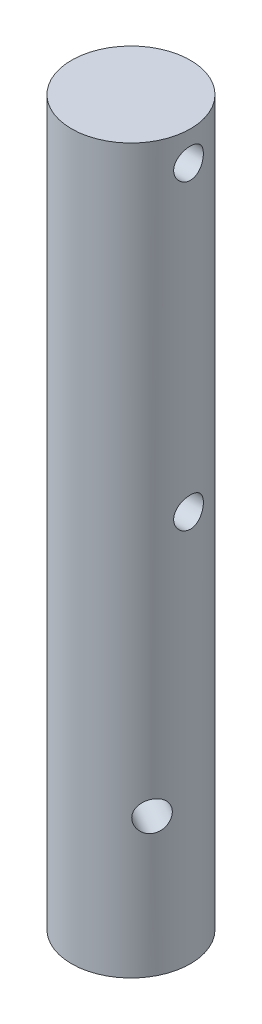
ISO-10303-21;
HEADER;
FILE_DESCRIPTION(('STEP AP214'),'2;1');
FILE_NAME('part.step','',(''),(''),'','','');
FILE_SCHEMA(('AUTOMOTIVE_DESIGN { 1 0 10303 214 1 1 1 1 }'));
ENDSEC;
DATA;
#1=APPLICATION_CONTEXT('core data for automotive mechanical design processes');
#2=APPLICATION_PROTOCOL_DEFINITION('international standard','automotive_design',2000,#1);
#3=PRODUCT_CONTEXT('',#1,'mechanical');
#4=PRODUCT('Part','Part','',(#3));
#5=PRODUCT_RELATED_PRODUCT_CATEGORY('part','',(#4));
#6=PRODUCT_DEFINITION_FORMATION('','',#4);
#7=PRODUCT_DEFINITION_CONTEXT('part definition',#1,'design');
#8=PRODUCT_DEFINITION('design','',#6,#7);
#9=PRODUCT_DEFINITION_SHAPE('','',#8);
#10=(LENGTH_UNIT() NAMED_UNIT(*) SI_UNIT(.MILLI.,.METRE.));
#11=(NAMED_UNIT(*) PLANE_ANGLE_UNIT() SI_UNIT($,.RADIAN.));
#12=(NAMED_UNIT(*) SI_UNIT($,.STERADIAN.) SOLID_ANGLE_UNIT());
#13=UNCERTAINTY_MEASURE_WITH_UNIT(LENGTH_MEASURE(1.E-05),#10,'distance_accuracy_value','');
#14=(GEOMETRIC_REPRESENTATION_CONTEXT(3) GLOBAL_UNCERTAINTY_ASSIGNED_CONTEXT((#13)) GLOBAL_UNIT_ASSIGNED_CONTEXT((#10,
#11,#12)) REPRESENTATION_CONTEXT('',''));
#15=CARTESIAN_POINT('',(0.,0.,0.));
#16=DIRECTION('',(0.,0.,1.));
#17=DIRECTION('',(1.,0.,0.));
#18=AXIS2_PLACEMENT_3D('',#15,#16,#17);
#19=CARTESIAN_POINT('',(-19.0091828831705,-210.,-53.2448828787845));
#20=DIRECTION('',(0.,-1.,0.));
#21=DIRECTION('',(0.,0.,-1.));
#22=AXIS2_PLACEMENT_3D('',#19,#20,#21);
#23=CYLINDRICAL_SURFACE('',#22,6.);
#24=CARTESIAN_POINT('',(-19.0091828831705,-210.,-53.2448828787845));
#25=DIRECTION('',(0.,1.,0.));
#26=DIRECTION('',(0.,0.,1.));
#27=AXIS2_PLACEMENT_3D('',#24,#25,#26);
#28=CIRCLE('',#27,6.);
#29=CARTESIAN_POINT('',(-19.0091828831705,-210.,-47.2448828787845));
#30=VERTEX_POINT('',#29);
#31=EDGE_CURVE('E10',#30,#30,#28,.T.);
#32=ORIENTED_EDGE('',*,*,#31,.F.);
#33=EDGE_LOOP('',(#32));
#34=FACE_BOUND('',#33,.T.);
#35=CARTESIAN_POINT('',(-19.0091828831705,-283.,-53.2448828787845));
#36=DIRECTION('',(0.,1.,0.));
#37=DIRECTION('',(0.,0.,1.));
#38=AXIS2_PLACEMENT_3D('',#35,#36,#37);
#39=CIRCLE('',#38,6.);
#40=CARTESIAN_POINT('',(-19.0091828831705,-283.,-47.2448828787845));
#41=VERTEX_POINT('',#40);
#42=EDGE_CURVE('E51',#41,#41,#39,.T.);
#43=ORIENTED_EDGE('',*,*,#42,.T.);
#44=EDGE_LOOP('',(#43));
#45=FACE_BOUND('',#44,.T.);
#46=CARTESIAN_POINT('',(-24.8186579024817,-213.,-51.7448828787845));
#47=CARTESIAN_POINT('',(-24.8186594836824,-212.917169549445,-51.7448852316294));
#48=CARTESIAN_POINT('',(-24.820448719254,-212.834313060793,-51.7517671314861));
#49=CARTESIAN_POINT('',(-24.82739405513,-212.670979453096,-51.779069003506));
#50=CARTESIAN_POINT('',(-24.8325521149014,-212.590503747319,-51.7994968547392));
#51=CARTESIAN_POINT('',(-24.8456152307463,-212.434317877088,-51.8531881590053));
#52=CARTESIAN_POINT('',(-24.853516739313,-212.358601706769,-51.8864350420718));
#53=CARTESIAN_POINT('',(-24.8711720353434,-212.213813488476,-51.9647701940276));
#54=CARTESIAN_POINT('',(-24.8809259014415,-212.144741722752,-52.0098589656481));
#55=CARTESIAN_POINT('',(-24.9014271813042,-212.013683012843,-52.1116578223974));
#56=CARTESIAN_POINT('',(-24.9121904689087,-211.95186383979,-52.1685807461621));
#57=CARTESIAN_POINT('',(-24.9333601362623,-211.838543163384,-52.2919736403241));
#58=CARTESIAN_POINT('',(-24.9437664825689,-211.787042624627,-52.3584445022763));
#59=CARTESIAN_POINT('',(-24.963225376294,-211.695134719421,-52.5001957581371));
#60=CARTESIAN_POINT('',(-24.9722570075741,-211.654892167103,-52.5755861330674));
#61=CARTESIAN_POINT('',(-24.9877677547264,-211.587714213508,-52.7323249682088));
#62=CARTESIAN_POINT('',(-24.9942472471766,-211.560776848851,-52.8136725473093));
#63=CARTESIAN_POINT('',(-25.0038114362596,-211.521511299253,-52.978267623532));
#64=CARTESIAN_POINT('',(-25.0069622462364,-211.508898213404,-53.0614432470551));
#65=CARTESIAN_POINT('',(-25.0097444478143,-211.497744972435,-53.2287855872268));
#66=CARTESIAN_POINT('',(-25.0093763597508,-211.499202736674,-53.3129521555073));
#67=CARTESIAN_POINT('',(-25.0052114528917,-211.51594491015,-53.4779112495431));
#68=CARTESIAN_POINT('',(-25.0014908972158,-211.530921795032,-53.5587372021861));
#69=CARTESIAN_POINT('',(-24.9911279023197,-211.573782762029,-53.716690249905));
#70=CARTESIAN_POINT('',(-24.9844853075612,-211.601667531226,-53.7938171478401));
#71=CARTESIAN_POINT('',(-24.9689079413759,-211.669801542412,-53.9429929340372));
#72=CARTESIAN_POINT('',(-24.9599530013409,-211.710160226797,-54.0149896434342));
#73=CARTESIAN_POINT('',(-24.9407223060284,-211.80201340747,-54.1512963122952));
#74=CARTESIAN_POINT('',(-24.9304463210855,-211.853509841136,-54.2156049314127));
#75=CARTESIAN_POINT('',(-24.9093651657877,-211.967825245189,-54.3365439314119));
#76=CARTESIAN_POINT('',(-24.898553200326,-212.030912935409,-54.3929193973973));
#77=CARTESIAN_POINT('',(-24.8778731442708,-212.165759984124,-54.494347442729));
#78=CARTESIAN_POINT('',(-24.8680050978064,-212.237519747695,-54.5393994928535));
#79=CARTESIAN_POINT('',(-24.8503058641604,-212.388174020489,-54.6170650723184));
#80=CARTESIAN_POINT('',(-24.8424847855249,-212.467101438188,-54.6496172292402));
#81=CARTESIAN_POINT('',(-24.8298947240103,-212.629551280846,-54.700911309739));
#82=CARTESIAN_POINT('',(-24.8251250880318,-212.71307271839,-54.7196561886138));
#83=CARTESIAN_POINT('',(-24.8193150194054,-212.879975700914,-54.7423806619836));
#84=CARTESIAN_POINT('',(-24.8181794177324,-212.963302675998,-54.7467371631363));
#85=CARTESIAN_POINT('',(-24.8195069440568,-213.129493161947,-54.7415930730938));
#86=CARTESIAN_POINT('',(-24.8219697407781,-213.212356714771,-54.7320937574938));
#87=CARTESIAN_POINT('',(-24.8301253748979,-213.373868558973,-54.6998381571471));
#88=CARTESIAN_POINT('',(-24.8357647045768,-213.452563635943,-54.6773013197535));
#89=CARTESIAN_POINT('',(-24.8495871927963,-213.605058874711,-54.6198537277868));
#90=CARTESIAN_POINT('',(-24.8577706526622,-213.678858455433,-54.584941507412));
#91=CARTESIAN_POINT('',(-24.8759597057301,-213.82106476672,-54.5029452795464));
#92=CARTESIAN_POINT('',(-24.8859978948104,-213.889337304026,-54.4556359310859));
#93=CARTESIAN_POINT('',(-24.9066853816008,-214.017113017681,-54.3504733181862));
#94=CARTESIAN_POINT('',(-24.9173347795414,-214.07661474999,-54.2926183209926));
#95=CARTESIAN_POINT('',(-24.9383673013602,-214.186686625543,-54.1662769602616));
#96=CARTESIAN_POINT('',(-24.9487370955415,-214.236996037529,-54.0975608075819));
#97=CARTESIAN_POINT('',(-24.9677661828529,-214.325361520171,-53.9524369028265));
#98=CARTESIAN_POINT('',(-24.9764255651943,-214.363418229965,-53.8760295522209));
#99=CARTESIAN_POINT('',(-24.9910035776004,-214.425867620717,-53.7182201813811));
#100=CARTESIAN_POINT('',(-24.996941863305,-214.450358570627,-53.6368589503263));
#101=CARTESIAN_POINT('',(-25.0054946435453,-214.485276200765,-53.4710075192627));
#102=CARTESIAN_POINT('',(-25.008109779531,-214.495705595243,-53.3865179263463));
#103=CARTESIAN_POINT('',(-25.0096954243027,-214.502051384363,-53.2192575891195));
#104=CARTESIAN_POINT('',(-25.0087625663707,-214.498352563643,-53.1365021383354));
#105=CARTESIAN_POINT('',(-25.0035713300319,-214.477428259058,-52.9728316341624));
#106=CARTESIAN_POINT('',(-24.999313050527,-214.46020317748,-52.8919165261131));
#107=CARTESIAN_POINT('',(-24.98796437598,-214.412921670344,-52.7346263253173));
#108=CARTESIAN_POINT('',(-24.9808893507105,-214.382934820028,-52.6582291369129));
#109=CARTESIAN_POINT('',(-24.9646522168713,-214.311044131471,-52.5115072992223));
#110=CARTESIAN_POINT('',(-24.9554898452366,-214.269138790996,-52.4411834168869));
#111=CARTESIAN_POINT('',(-24.9357916283905,-214.173427149004,-52.3067799861486));
#112=CARTESIAN_POINT('',(-24.9252281373547,-214.119359785639,-52.2428903963336));
#113=CARTESIAN_POINT('',(-24.9040426189692,-214.001365722039,-52.1249603483776));
#114=CARTESIAN_POINT('',(-24.8934205774589,-213.937436525853,-52.0709223911822));
#115=CARTESIAN_POINT('',(-24.8730950210788,-213.800097878698,-51.9732398390656));
#116=CARTESIAN_POINT('',(-24.8634123391188,-213.726533814881,-51.9298079496147));
#117=CARTESIAN_POINT('',(-24.8463422164298,-213.572916765116,-51.855992533861));
#118=CARTESIAN_POINT('',(-24.8389531068711,-213.49286855084,-51.8255995141449));
#119=CARTESIAN_POINT('',(-24.8284615142673,-213.34413448226,-51.7832490859363));
#120=CARTESIAN_POINT('',(-24.8248128281787,-213.276160253424,-51.7688931228914));
#121=CARTESIAN_POINT('',(-24.8199104619541,-213.1387966965,-51.7497094399246));
#122=CARTESIAN_POINT('',(-24.81865657752,-213.069407489632,-51.7448809072262));
#123=CARTESIAN_POINT('',(-24.8186579024817,-213.,-51.7448828787845));
#124=B_SPLINE_CURVE_WITH_KNOTS('',3,(#46,#47,#48,#49,#50,#51,#52,#53,#54,#55,#56,#57,#58,#59,
#60,#61,#62,#63,#64,#65,#66,#67,#68,#69,#70,#71,#72,#73,#74,#75,#76,#77,#78,#79,#80,#81,#82,#83,
#84,#85,#86,#87,#88,#89,#90,#91,#92,#93,#94,#95,#96,#97,#98,#99,#100,#101,#102,#103,#104,#105,
#106,#107,#108,#109,#110,#111,#112,#113,#114,#115,#116,#117,#118,#119,#120,#121,#122,#123),
.UNSPECIFIED.,.T.,.F.,(4,2,2,2,2,2,2,2,2,2,2,2,2,2,2,2,2,2,2,2,2,2,2,2,2,2,2,2,2,2,2,2,2,2,2,2,
2,2,4),(0.,0.248236465041684,0.496617444857199,0.744678436299644,0.992749960532891,
1.24574372515788,1.49876112887921,1.75530897838753,2.01181895908258,2.26313250597209,
2.51440889199613,2.7601095761337,3.00582334034872,3.25375724552665,3.50173431281347,
3.75642279943147,4.01112318719882,4.26705859205042,4.52293920077729,4.77206144857032,
5.02116076310284,5.26618443005529,5.51123712852856,5.76109707515499,6.01099811331029,
6.26715198579193,6.52329249431732,6.77755243684159,7.03176329345425,7.27910067676476,
7.5264307042619,7.77242925935828,8.01845883442845,8.27038257949245,8.52237018939307,
8.77905886370805,9.03556032819972,9.24358696306398,9.45159585059714),.UNSPECIFIED.);
#125=CARTESIAN_POINT('',(-24.8186579024817,-213.,-51.7448828787845));
#126=VERTEX_POINT('',#125);
#127=EDGE_CURVE('E56',#126,#126,#124,.T.);
#128=ORIENTED_EDGE('',*,*,#127,.F.);
#129=EDGE_LOOP('',(#128));
#130=FACE_BOUND('',#129,.T.);
#131=CARTESIAN_POINT('',(-13.1997078638594,-213.,-51.7448828787845));
#132=CARTESIAN_POINT('',(-13.1997062826587,-213.082830450555,-51.7448852316294));
#133=CARTESIAN_POINT('',(-13.1979170470871,-213.165686939207,-51.7517671314861));
#134=CARTESIAN_POINT('',(-13.190971711211,-213.329020546904,-51.779069003506));
#135=CARTESIAN_POINT('',(-13.1858136514397,-213.409496252681,-51.7994968547392));
#136=CARTESIAN_POINT('',(-13.1727505355947,-213.565682122912,-51.8531881590053));
#137=CARTESIAN_POINT('',(-13.1648490270281,-213.641398293231,-51.8864350420718));
#138=CARTESIAN_POINT('',(-13.1471937309977,-213.786186511524,-51.9647701940276));
#139=CARTESIAN_POINT('',(-13.1374398648995,-213.855258277248,-52.0098589656481));
#140=CARTESIAN_POINT('',(-13.1169385850369,-213.986316987157,-52.1116578223974));
#141=CARTESIAN_POINT('',(-13.1061752974323,-214.04813616021,-52.1685807461621));
#142=CARTESIAN_POINT('',(-13.0850056300787,-214.161456836616,-52.2919736403241));
#143=CARTESIAN_POINT('',(-13.0745992837722,-214.212957375373,-52.3584445022763));
#144=CARTESIAN_POINT('',(-13.055140390047,-214.304865280579,-52.5001957581371));
#145=CARTESIAN_POINT('',(-13.046108758767,-214.345107832897,-52.5755861330674));
#146=CARTESIAN_POINT('',(-13.0305980116146,-214.412285786492,-52.7323249682088));
#147=CARTESIAN_POINT('',(-13.0241185191645,-214.439223151149,-52.8136725473093));
#148=CARTESIAN_POINT('',(-13.0145543300814,-214.478488700747,-52.978267623532));
#149=CARTESIAN_POINT('',(-13.0114035201046,-214.491101786596,-53.0614432470551));
#150=CARTESIAN_POINT('',(-13.0086213185267,-214.502255027565,-53.2287855872268));
#151=CARTESIAN_POINT('',(-13.0089894065903,-214.500797263326,-53.3129521555073));
#152=CARTESIAN_POINT('',(-13.0131543134493,-214.48405508985,-53.4779112495431));
#153=CARTESIAN_POINT('',(-13.0168748691253,-214.469078204968,-53.5587372021861));
#154=CARTESIAN_POINT('',(-13.0272378640214,-214.426217237971,-53.716690249905));
#155=CARTESIAN_POINT('',(-13.0338804587799,-214.398332468774,-53.7938171478401));
#156=CARTESIAN_POINT('',(-13.0494578249652,-214.330198457588,-53.9429929340372));
#157=CARTESIAN_POINT('',(-13.0584127650002,-214.289839773203,-54.0149896434342));
#158=CARTESIAN_POINT('',(-13.0776434603126,-214.19798659253,-54.1512963122952));
#159=CARTESIAN_POINT('',(-13.0879194452556,-214.146490158864,-54.2156049314127));
#160=CARTESIAN_POINT('',(-13.1090006005534,-214.032174754811,-54.3365439314119));
#161=CARTESIAN_POINT('',(-13.119812566015,-213.969087064591,-54.3929193973973));
#162=CARTESIAN_POINT('',(-13.1404926220703,-213.834240015876,-54.494347442729));
#163=CARTESIAN_POINT('',(-13.1503606685347,-213.762480252305,-54.5393994928535));
#164=CARTESIAN_POINT('',(-13.1680599021806,-213.611825979511,-54.6170650723184));
#165=CARTESIAN_POINT('',(-13.1758809808162,-213.532898561812,-54.6496172292402));
#166=CARTESIAN_POINT('',(-13.1884710423308,-213.370448719154,-54.700911309739));
#167=CARTESIAN_POINT('',(-13.1932406783092,-213.28692728161,-54.7196561886138));
#168=CARTESIAN_POINT('',(-13.1990507469357,-213.120024299086,-54.7423806619836));
#169=CARTESIAN_POINT('',(-13.2001863486086,-213.036697324002,-54.7467371631363));
#170=CARTESIAN_POINT('',(-13.1988588222843,-212.870506838053,-54.7415930730938));
#171=CARTESIAN_POINT('',(-13.1963960255629,-212.787643285229,-54.7320937574938));
#172=CARTESIAN_POINT('',(-13.1882403914432,-212.626131441027,-54.6998381571471));
#173=CARTESIAN_POINT('',(-13.1826010617643,-212.547436364057,-54.6773013197535));
#174=CARTESIAN_POINT('',(-13.1687785735448,-212.394941125289,-54.6198537277868));
#175=CARTESIAN_POINT('',(-13.1605951136789,-212.321141544567,-54.584941507412));
#176=CARTESIAN_POINT('',(-13.142406060611,-212.17893523328,-54.5029452795464));
#177=CARTESIAN_POINT('',(-13.1323678715307,-212.110662695974,-54.4556359310859));
#178=CARTESIAN_POINT('',(-13.1116803847402,-211.982886982319,-54.3504733181862));
#179=CARTESIAN_POINT('',(-13.1010309867997,-211.92338525001,-54.2926183209926));
#180=CARTESIAN_POINT('',(-13.0799984649809,-211.813313374457,-54.1662769602616));
#181=CARTESIAN_POINT('',(-13.0696286707995,-211.763003962471,-54.0975608075819));
#182=CARTESIAN_POINT('',(-13.0505995834881,-211.674638479829,-53.9524369028265));
#183=CARTESIAN_POINT('',(-13.0419402011468,-211.636581770035,-53.8760295522209));
#184=CARTESIAN_POINT('',(-13.0273621887406,-211.574132379283,-53.7182201813811));
#185=CARTESIAN_POINT('',(-13.0214239030361,-211.549641429373,-53.6368589503263));
#186=CARTESIAN_POINT('',(-13.0128711227958,-211.514723799235,-53.4710075192627));
#187=CARTESIAN_POINT('',(-13.0102559868101,-211.504294404757,-53.3865179263464));
#188=CARTESIAN_POINT('',(-13.0086703420384,-211.497948615637,-53.2192575891195));
#189=CARTESIAN_POINT('',(-13.0096031999704,-211.501647436357,-53.1365021383354));
#190=CARTESIAN_POINT('',(-13.0147944363092,-211.522571740941,-52.9728316341624));
#191=CARTESIAN_POINT('',(-13.0190527158141,-211.53979682252,-52.8919165261131));
#192=CARTESIAN_POINT('',(-13.0304013903611,-211.587078329656,-52.7346263253173));
#193=CARTESIAN_POINT('',(-13.0374764156305,-211.617065179972,-52.6582291369129));
#194=CARTESIAN_POINT('',(-13.0537135494698,-211.688955868529,-52.5115072992223));
#195=CARTESIAN_POINT('',(-13.0628759211045,-211.730861209004,-52.4411834168869));
#196=CARTESIAN_POINT('',(-13.0825741379505,-211.826572850996,-52.3067799861486));
#197=CARTESIAN_POINT('',(-13.0931376289864,-211.880640214361,-52.2428903963336));
#198=CARTESIAN_POINT('',(-13.1143231473719,-211.998634277961,-52.1249603483776));
#199=CARTESIAN_POINT('',(-13.1249451888822,-212.062563474147,-52.0709223911822));
#200=CARTESIAN_POINT('',(-13.1452707452623,-212.199902121302,-51.9732398390656));
#201=CARTESIAN_POINT('',(-13.1549534272223,-212.273466185119,-51.9298079496146));
#202=CARTESIAN_POINT('',(-13.1720235499113,-212.427083234884,-51.855992533861));
#203=CARTESIAN_POINT('',(-13.17941265947,-212.50713144916,-51.8255995141449));
#204=CARTESIAN_POINT('',(-13.1899042520738,-212.65586551774,-51.7832490859363));
#205=CARTESIAN_POINT('',(-13.1935529381623,-212.723839746576,-51.7688931228914));
#206=CARTESIAN_POINT('',(-13.198455304387,-212.8612033035,-51.7497094399246));
#207=CARTESIAN_POINT('',(-13.1997091888211,-212.930592510368,-51.7448809072262));
#208=CARTESIAN_POINT('',(-13.1997078638594,-213.,-51.7448828787845));
#209=B_SPLINE_CURVE_WITH_KNOTS('',3,(#131,#132,#133,#134,#135,#136,#137,#138,#139,#140,#141,
#142,#143,#144,#145,#146,#147,#148,#149,#150,#151,#152,#153,#154,#155,#156,#157,#158,#159,#160,
#161,#162,#163,#164,#165,#166,#167,#168,#169,#170,#171,#172,#173,#174,#175,#176,#177,#178,#179,
#180,#181,#182,#183,#184,#185,#186,#187,#188,#189,#190,#191,#192,#193,#194,#195,#196,#197,#198,
#199,#200,#201,#202,#203,#204,#205,#206,#207,#208),.UNSPECIFIED.,.T.,.F.,(4,2,2,2,2,2,2,2,2,2,2,
2,2,2,2,2,2,2,2,2,2,2,2,2,2,2,2,2,2,2,2,2,2,2,2,2,2,2,4),(0.,0.248236465041684,
0.496617444857199,0.744678436299612,0.992749960532891,1.24574372515788,1.49876112887921,
1.75530897838754,2.01181895908258,2.26313250597209,2.51440889199613,2.7601095761337,
3.00582334034872,3.25375724552665,3.50173431281347,3.75642279943146,4.01112318719882,
4.26705859205042,4.52293920077729,4.77206144857032,5.02116076310284,5.26618443005528,
5.51123712852855,5.76109707515498,6.01099811331029,6.26715198579192,6.52329249431732,
6.77755243684156,7.03176329345424,7.27910067676475,7.5264307042619,7.77242925935828,
8.01845883442845,8.27038257949244,8.52237018939307,8.77905886370809,9.03556032819972,
9.24358696306398,9.45159585059714),.UNSPECIFIED.);
#210=CARTESIAN_POINT('',(-13.1997078638594,-213.,-51.7448828787845));
#211=VERTEX_POINT('',#210);
#212=EDGE_CURVE('E57',#211,#211,#209,.T.);
#213=ORIENTED_EDGE('',*,*,#212,.F.);
#214=EDGE_LOOP('',(#213));
#215=FACE_BOUND('',#214,.T.);
#216=CARTESIAN_POINT('',(-24.8186579024817,-243.5,-51.7448828787845));
#217=CARTESIAN_POINT('',(-24.8186594836824,-243.417169549445,-51.7448852316294));
#218=CARTESIAN_POINT('',(-24.820448719254,-243.334313060793,-51.7517671314861));
#219=CARTESIAN_POINT('',(-24.82739405513,-243.170979453096,-51.779069003506));
#220=CARTESIAN_POINT('',(-24.8325521149014,-243.090503747319,-51.7994968547392));
#221=CARTESIAN_POINT('',(-24.8456152307463,-242.934317877088,-51.8531881590053));
#222=CARTESIAN_POINT('',(-24.853516739313,-242.858601706769,-51.8864350420718));
#223=CARTESIAN_POINT('',(-24.8711720353434,-242.713813488476,-51.9647701940276));
#224=CARTESIAN_POINT('',(-24.8809259014415,-242.644741722752,-52.0098589656481));
#225=CARTESIAN_POINT('',(-24.9014271813042,-242.513683012843,-52.1116578223974));
#226=CARTESIAN_POINT('',(-24.9121904689087,-242.45186383979,-52.1685807461621));
#227=CARTESIAN_POINT('',(-24.9333601362623,-242.338543163384,-52.2919736403241));
#228=CARTESIAN_POINT('',(-24.9437664825689,-242.287042624627,-52.3584445022763));
#229=CARTESIAN_POINT('',(-24.963225376294,-242.195134719421,-52.5001957581371));
#230=CARTESIAN_POINT('',(-24.9722570075741,-242.154892167103,-52.5755861330674));
#231=CARTESIAN_POINT('',(-24.9877677547264,-242.087714213508,-52.7323249682088));
#232=CARTESIAN_POINT('',(-24.9942472471766,-242.060776848851,-52.8136725473093));
#233=CARTESIAN_POINT('',(-25.0038114362596,-242.021511299253,-52.978267623532));
#234=CARTESIAN_POINT('',(-25.0069622462364,-242.008898213404,-53.0614432470551));
#235=CARTESIAN_POINT('',(-25.0097444478143,-241.997744972435,-53.2287855872268));
#236=CARTESIAN_POINT('',(-25.0093763597508,-241.999202736674,-53.3129521555073));
#237=CARTESIAN_POINT('',(-25.0052114528917,-242.01594491015,-53.4779112495431));
#238=CARTESIAN_POINT('',(-25.0014908972158,-242.030921795032,-53.5587372021861));
#239=CARTESIAN_POINT('',(-24.9911279023197,-242.073782762029,-53.716690249905));
#240=CARTESIAN_POINT('',(-24.9844853075612,-242.101667531226,-53.7938171478401));
#241=CARTESIAN_POINT('',(-24.9689079413759,-242.169801542412,-53.9429929340372));
#242=CARTESIAN_POINT('',(-24.9599530013408,-242.210160226797,-54.0149896434342));
#243=CARTESIAN_POINT('',(-24.9407223060284,-242.30201340747,-54.1512963122952));
#244=CARTESIAN_POINT('',(-24.9304463210855,-242.353509841136,-54.2156049314127));
#245=CARTESIAN_POINT('',(-24.9093651657877,-242.467825245189,-54.3365439314119));
#246=CARTESIAN_POINT('',(-24.898553200326,-242.530912935409,-54.3929193973973));
#247=CARTESIAN_POINT('',(-24.8778731442708,-242.665759984124,-54.494347442729));
#248=CARTESIAN_POINT('',(-24.8680050978064,-242.737519747695,-54.5393994928535));
#249=CARTESIAN_POINT('',(-24.8503058641604,-242.888174020489,-54.6170650723184));
#250=CARTESIAN_POINT('',(-24.8424847855249,-242.967101438188,-54.6496172292402));
#251=CARTESIAN_POINT('',(-24.8298947240103,-243.129551280846,-54.700911309739));
#252=CARTESIAN_POINT('',(-24.8251250880318,-243.21307271839,-54.7196561886138));
#253=CARTESIAN_POINT('',(-24.8193150194054,-243.379975700914,-54.7423806619836));
#254=CARTESIAN_POINT('',(-24.8181794177324,-243.463302675998,-54.7467371631363));
#255=CARTESIAN_POINT('',(-24.8195069440568,-243.629493161947,-54.7415930730938));
#256=CARTESIAN_POINT('',(-24.8219697407781,-243.712356714771,-54.7320937574938));
#257=CARTESIAN_POINT('',(-24.8301253748979,-243.873868558973,-54.6998381571471));
#258=CARTESIAN_POINT('',(-24.8357647045768,-243.952563635943,-54.6773013197535));
#259=CARTESIAN_POINT('',(-24.8495871927963,-244.105058874711,-54.6198537277868));
#260=CARTESIAN_POINT('',(-24.8577706526622,-244.178858455433,-54.584941507412));
#261=CARTESIAN_POINT('',(-24.8759597057301,-244.32106476672,-54.5029452795464));
#262=CARTESIAN_POINT('',(-24.8859978948104,-244.389337304026,-54.4556359310858));
#263=CARTESIAN_POINT('',(-24.9066853816008,-244.517113017681,-54.3504733181862));
#264=CARTESIAN_POINT('',(-24.9173347795414,-244.57661474999,-54.2926183209926));
#265=CARTESIAN_POINT('',(-24.9383673013602,-244.686686625543,-54.1662769602616));
#266=CARTESIAN_POINT('',(-24.9487370955415,-244.736996037529,-54.0975608075819));
#267=CARTESIAN_POINT('',(-24.9677661828529,-244.825361520171,-53.9524369028265));
#268=CARTESIAN_POINT('',(-24.9764255651943,-244.863418229965,-53.8760295522209));
#269=CARTESIAN_POINT('',(-24.9910035776004,-244.925867620717,-53.7182201813811));
#270=CARTESIAN_POINT('',(-24.996941863305,-244.950358570627,-53.6368589503263));
#271=CARTESIAN_POINT('',(-25.0054946435453,-244.985276200765,-53.4710075192627));
#272=CARTESIAN_POINT('',(-25.008109779531,-244.995705595243,-53.3865179263463));
#273=CARTESIAN_POINT('',(-25.0096954243027,-245.002051384363,-53.2192575891195));
#274=CARTESIAN_POINT('',(-25.0087625663707,-244.998352563643,-53.1365021383354));
#275=CARTESIAN_POINT('',(-25.0035713300319,-244.977428259058,-52.9728316341624));
#276=CARTESIAN_POINT('',(-24.999313050527,-244.96020317748,-52.8919165261131));
#277=CARTESIAN_POINT('',(-24.98796437598,-244.912921670344,-52.7346263253173));
#278=CARTESIAN_POINT('',(-24.9808893507105,-244.882934820028,-52.658229136913));
#279=CARTESIAN_POINT('',(-24.9646522168713,-244.811044131471,-52.5115072992223));
#280=CARTESIAN_POINT('',(-24.9554898452366,-244.769138790996,-52.4411834168869));
#281=CARTESIAN_POINT('',(-24.9357916283905,-244.673427149004,-52.3067799861486));
#282=CARTESIAN_POINT('',(-24.9252281373547,-244.619359785639,-52.2428903963336));
#283=CARTESIAN_POINT('',(-24.9040426189692,-244.501365722039,-52.1249603483776));
#284=CARTESIAN_POINT('',(-24.8934205774589,-244.437436525853,-52.0709223911822));
#285=CARTESIAN_POINT('',(-24.8730950210788,-244.300097878698,-51.9732398390656));
#286=CARTESIAN_POINT('',(-24.8634123391188,-244.226533814881,-51.9298079496147));
#287=CARTESIAN_POINT('',(-24.8463422164298,-244.072916765116,-51.855992533861));
#288=CARTESIAN_POINT('',(-24.8389531068711,-243.99286855084,-51.8255995141449));
#289=CARTESIAN_POINT('',(-24.8284615142673,-243.84413448226,-51.7832490859363));
#290=CARTESIAN_POINT('',(-24.8248128281787,-243.776160253424,-51.7688931228914));
#291=CARTESIAN_POINT('',(-24.8199104619541,-243.6387966965,-51.7497094399246));
#292=CARTESIAN_POINT('',(-24.81865657752,-243.569407489632,-51.7448809072262));
#293=CARTESIAN_POINT('',(-24.8186579024817,-243.5,-51.7448828787845));
#294=B_SPLINE_CURVE_WITH_KNOTS('',3,(#216,#217,#218,#219,#220,#221,#222,#223,#224,#225,#226,
#227,#228,#229,#230,#231,#232,#233,#234,#235,#236,#237,#238,#239,#240,#241,#242,#243,#244,#245,
#246,#247,#248,#249,#250,#251,#252,#253,#254,#255,#256,#257,#258,#259,#260,#261,#262,#263,#264,
#265,#266,#267,#268,#269,#270,#271,#272,#273,#274,#275,#276,#277,#278,#279,#280,#281,#282,#283,
#284,#285,#286,#287,#288,#289,#290,#291,#292,#293),.UNSPECIFIED.,.T.,.F.,(4,2,2,2,2,2,2,2,2,2,2,
2,2,2,2,2,2,2,2,2,2,2,2,2,2,2,2,2,2,2,2,2,2,2,2,2,2,2,4),(0.,0.248236465041684,
0.496617444857199,0.744678436299613,0.992749960532891,1.24574372515788,1.49876112887921,
1.75530897838753,2.01181895908258,2.26313250597209,2.51440889199613,2.7601095761337,
3.00582334034872,3.25375724552668,3.50173431281347,3.75642279943146,4.01112318719882,
4.26705859205042,4.52293920077729,4.77206144857032,5.02116076310284,5.26618443005528,
5.51123712852855,5.76109707515498,6.01099811331029,6.26715198579195,6.52329249431732,
6.77755243684159,7.03176329345425,7.27910067676476,7.5264307042619,7.77242925935827,
8.01845883442845,8.27038257949242,8.52237018939307,8.77905886370802,9.03556032819972,
9.24358696306398,9.45159585059715),.UNSPECIFIED.);
#295=CARTESIAN_POINT('',(-24.8186579024817,-243.5,-51.7448828787845));
#296=VERTEX_POINT('',#295);
#297=EDGE_CURVE('E102',#296,#296,#294,.T.);
#298=ORIENTED_EDGE('',*,*,#297,.F.);
#299=EDGE_LOOP('',(#298));
#300=FACE_BOUND('',#299,.T.);
#301=CARTESIAN_POINT('',(-13.1997078638594,-243.5,-51.7448828787845));
#302=CARTESIAN_POINT('',(-13.1997062826587,-243.582830450555,-51.7448852316294));
#303=CARTESIAN_POINT('',(-13.1979170470871,-243.665686939207,-51.7517671314861));
#304=CARTESIAN_POINT('',(-13.190971711211,-243.829020546904,-51.779069003506));
#305=CARTESIAN_POINT('',(-13.1858136514397,-243.909496252681,-51.7994968547392));
#306=CARTESIAN_POINT('',(-13.1727505355947,-244.065682122912,-51.8531881590053));
#307=CARTESIAN_POINT('',(-13.1648490270281,-244.141398293231,-51.8864350420718));
#308=CARTESIAN_POINT('',(-13.1471937309977,-244.286186511524,-51.9647701940276));
#309=CARTESIAN_POINT('',(-13.1374398648995,-244.355258277248,-52.0098589656481));
#310=CARTESIAN_POINT('',(-13.1169385850369,-244.486316987157,-52.1116578223974));
#311=CARTESIAN_POINT('',(-13.1061752974323,-244.54813616021,-52.1685807461621));
#312=CARTESIAN_POINT('',(-13.0850056300787,-244.661456836616,-52.2919736403241));
#313=CARTESIAN_POINT('',(-13.0745992837722,-244.712957375373,-52.3584445022763));
#314=CARTESIAN_POINT('',(-13.055140390047,-244.804865280579,-52.5001957581371));
#315=CARTESIAN_POINT('',(-13.046108758767,-244.845107832897,-52.5755861330674));
#316=CARTESIAN_POINT('',(-13.0305980116146,-244.912285786492,-52.7323249682088));
#317=CARTESIAN_POINT('',(-13.0241185191645,-244.939223151149,-52.8136725473093));
#318=CARTESIAN_POINT('',(-13.0145543300814,-244.978488700747,-52.978267623532));
#319=CARTESIAN_POINT('',(-13.0114035201046,-244.991101786596,-53.0614432470551));
#320=CARTESIAN_POINT('',(-13.0086213185267,-245.002255027565,-53.2287855872268));
#321=CARTESIAN_POINT('',(-13.0089894065903,-245.000797263326,-53.3129521555073));
#322=CARTESIAN_POINT('',(-13.0131543134493,-244.98405508985,-53.4779112495431));
#323=CARTESIAN_POINT('',(-13.0168748691253,-244.969078204968,-53.5587372021861));
#324=CARTESIAN_POINT('',(-13.0272378640214,-244.926217237971,-53.716690249905));
#325=CARTESIAN_POINT('',(-13.0338804587799,-244.898332468774,-53.7938171478401));
#326=CARTESIAN_POINT('',(-13.0494578249652,-244.830198457588,-53.9429929340372));
#327=CARTESIAN_POINT('',(-13.0584127650002,-244.789839773203,-54.0149896434342));
#328=CARTESIAN_POINT('',(-13.0776434603126,-244.69798659253,-54.1512963122952));
#329=CARTESIAN_POINT('',(-13.0879194452556,-244.646490158864,-54.2156049314127));
#330=CARTESIAN_POINT('',(-13.1090006005534,-244.532174754811,-54.3365439314119));
#331=CARTESIAN_POINT('',(-13.119812566015,-244.469087064591,-54.3929193973973));
#332=CARTESIAN_POINT('',(-13.1404926220703,-244.334240015876,-54.494347442729));
#333=CARTESIAN_POINT('',(-13.1503606685347,-244.262480252305,-54.5393994928535));
#334=CARTESIAN_POINT('',(-13.1680599021806,-244.111825979511,-54.6170650723184));
#335=CARTESIAN_POINT('',(-13.1758809808162,-244.032898561812,-54.6496172292402));
#336=CARTESIAN_POINT('',(-13.1884710423308,-243.870448719154,-54.700911309739));
#337=CARTESIAN_POINT('',(-13.1932406783092,-243.78692728161,-54.7196561886138));
#338=CARTESIAN_POINT('',(-13.1990507469357,-243.620024299086,-54.7423806619836));
#339=CARTESIAN_POINT('',(-13.2001863486086,-243.536697324002,-54.7467371631363));
#340=CARTESIAN_POINT('',(-13.1988588222843,-243.370506838053,-54.7415930730938));
#341=CARTESIAN_POINT('',(-13.1963960255629,-243.287643285229,-54.7320937574938));
#342=CARTESIAN_POINT('',(-13.1882403914432,-243.126131441027,-54.6998381571471));
#343=CARTESIAN_POINT('',(-13.1826010617643,-243.047436364057,-54.6773013197535));
#344=CARTESIAN_POINT('',(-13.1687785735448,-242.894941125289,-54.6198537277868));
#345=CARTESIAN_POINT('',(-13.1605951136789,-242.821141544567,-54.584941507412));
#346=CARTESIAN_POINT('',(-13.142406060611,-242.67893523328,-54.5029452795464));
#347=CARTESIAN_POINT('',(-13.1323678715307,-242.610662695974,-54.4556359310859));
#348=CARTESIAN_POINT('',(-13.1116803847402,-242.482886982319,-54.3504733181862));
#349=CARTESIAN_POINT('',(-13.1010309867997,-242.42338525001,-54.2926183209926));
#350=CARTESIAN_POINT('',(-13.0799984649809,-242.313313374457,-54.1662769602616));
#351=CARTESIAN_POINT('',(-13.0696286707995,-242.263003962471,-54.0975608075819));
#352=CARTESIAN_POINT('',(-13.0505995834881,-242.174638479829,-53.9524369028265));
#353=CARTESIAN_POINT('',(-13.0419402011468,-242.136581770035,-53.8760295522209));
#354=CARTESIAN_POINT('',(-13.0273621887406,-242.074132379283,-53.7182201813811));
#355=CARTESIAN_POINT('',(-13.0214239030361,-242.049641429373,-53.6368589503263));
#356=CARTESIAN_POINT('',(-13.0128711227958,-242.014723799235,-53.4710075192627));
#357=CARTESIAN_POINT('',(-13.0102559868101,-242.004294404757,-53.3865179263464));
#358=CARTESIAN_POINT('',(-13.0086703420384,-241.997948615637,-53.2192575891195));
#359=CARTESIAN_POINT('',(-13.0096031999704,-242.001647436357,-53.1365021383354));
#360=CARTESIAN_POINT('',(-13.0147944363092,-242.022571740941,-52.9728316341624));
#361=CARTESIAN_POINT('',(-13.0190527158141,-242.03979682252,-52.8919165261131));
#362=CARTESIAN_POINT('',(-13.0304013903611,-242.087078329656,-52.7346263253173));
#363=CARTESIAN_POINT('',(-13.0374764156305,-242.117065179972,-52.6582291369129));
#364=CARTESIAN_POINT('',(-13.0537135494698,-242.188955868529,-52.5115072992223));
#365=CARTESIAN_POINT('',(-13.0628759211045,-242.230861209004,-52.4411834168869));
#366=CARTESIAN_POINT('',(-13.0825741379505,-242.326572850996,-52.3067799861486));
#367=CARTESIAN_POINT('',(-13.0931376289864,-242.380640214361,-52.2428903963336));
#368=CARTESIAN_POINT('',(-13.1143231473719,-242.498634277961,-52.1249603483776));
#369=CARTESIAN_POINT('',(-13.1249451888822,-242.562563474147,-52.0709223911822));
#370=CARTESIAN_POINT('',(-13.1452707452623,-242.699902121302,-51.9732398390656));
#371=CARTESIAN_POINT('',(-13.1549534272223,-242.773466185119,-51.9298079496146));
#372=CARTESIAN_POINT('',(-13.1720235499113,-242.927083234884,-51.855992533861));
#373=CARTESIAN_POINT('',(-13.17941265947,-243.00713144916,-51.8255995141449));
#374=CARTESIAN_POINT('',(-13.1899042520738,-243.15586551774,-51.7832490859363));
#375=CARTESIAN_POINT('',(-13.1935529381623,-243.223839746576,-51.7688931228914));
#376=CARTESIAN_POINT('',(-13.198455304387,-243.3612033035,-51.7497094399246));
#377=CARTESIAN_POINT('',(-13.1997091888211,-243.430592510368,-51.7448809072262));
#378=CARTESIAN_POINT('',(-13.1997078638594,-243.5,-51.7448828787845));
#379=B_SPLINE_CURVE_WITH_KNOTS('',3,(#301,#302,#303,#304,#305,#306,#307,#308,#309,#310,#311,
#312,#313,#314,#315,#316,#317,#318,#319,#320,#321,#322,#323,#324,#325,#326,#327,#328,#329,#330,
#331,#332,#333,#334,#335,#336,#337,#338,#339,#340,#341,#342,#343,#344,#345,#346,#347,#348,#349,
#350,#351,#352,#353,#354,#355,#356,#357,#358,#359,#360,#361,#362,#363,#364,#365,#366,#367,#368,
#369,#370,#371,#372,#373,#374,#375,#376,#377,#378),.UNSPECIFIED.,.T.,.F.,(4,2,2,2,2,2,2,2,2,2,2,
2,2,2,2,2,2,2,2,2,2,2,2,2,2,2,2,2,2,2,2,2,2,2,2,2,2,2,4),(0.,0.248236465041684,
0.496617444857199,0.744678436299643,0.992749960532891,1.24574372515788,1.49876112887921,
1.75530897838753,2.01181895908258,2.26313250597209,2.51440889199613,2.7601095761337,
3.00582334034872,3.25375724552668,3.50173431281347,3.75642279943146,4.01112318719882,
4.26705859205042,4.52293920077729,4.77206144857032,5.02116076310284,5.26618443005528,
5.51123712852855,5.76109707515495,6.01099811331029,6.26715198579195,6.52329249431733,
6.77755243684157,7.03176329345425,7.27910067676476,7.5264307042619,7.77242925935828,
8.01845883442845,8.27038257949245,8.52237018939307,8.77905886370812,9.03556032819972,
9.24358696306398,9.45159585059715),.UNSPECIFIED.);
#380=CARTESIAN_POINT('',(-13.1997078638594,-243.5,-51.7448828787845));
#381=VERTEX_POINT('',#380);
#382=EDGE_CURVE('E68',#381,#381,#379,.T.);
#383=ORIENTED_EDGE('',*,*,#382,.F.);
#384=EDGE_LOOP('',(#383));
#385=FACE_BOUND('',#384,.T.);
#386=CARTESIAN_POINT('',(-24.7903358325451,-269.,-54.8505822827634));
#387=CARTESIAN_POINT('',(-24.7903360254826,-268.917169549445,-54.8505851109872));
#388=CARTESIAN_POINT('',(-24.7884445990126,-268.834313060793,-54.8574396288752));
#389=CARTESIAN_POINT('',(-24.7808085003091,-268.670979453096,-54.8845564115534));
#390=CARTESIAN_POINT('',(-24.7750615854888,-268.590503747319,-54.9048264795517));
#391=CARTESIAN_POINT('',(-24.75952892353,-268.434317877088,-54.957856070931));
#392=CARTESIAN_POINT('',(-24.7497483891437,-268.358601706769,-54.9905994705465));
#393=CARTESIAN_POINT('',(-24.7258707480394,-268.213813488476,-55.0672673501648));
#394=CARTESIAN_POINT('',(-24.7117734580554,-268.144741722752,-55.1111923048626));
#395=CARTESIAN_POINT('',(-24.6786286588519,-268.013683012843,-55.209603340815));
#396=CARTESIAN_POINT('',(-24.6594884774633,-267.95186383979,-55.2642816826552));
#397=CARTESIAN_POINT('',(-24.6161255001001,-267.838543163384,-55.3817278973228));
#398=CARTESIAN_POINT('',(-24.5919022293861,-267.787042624627,-55.4444965255382));
#399=CARTESIAN_POINT('',(-24.5378784977512,-267.695134719421,-55.5769861609946));
#400=CARTESIAN_POINT('',(-24.5080049324122,-267.654892167103,-55.6467919565251));
#401=CARTESIAN_POINT('',(-24.4430682159071,-267.587714213508,-55.7902871430933));
#402=CARTESIAN_POINT('',(-24.4080058314223,-267.560776848851,-55.8639759593557));
#403=CARTESIAN_POINT('',(-24.3339911240235,-267.521511299253,-56.0113015712439));
#404=CARTESIAN_POINT('',(-24.2951319937443,-267.508898213404,-56.0849091791789));
#405=CARTESIAN_POINT('',(-24.2138702809034,-267.497744972435,-56.2312229976854));
#406=CARTESIAN_POINT('',(-24.1714682231492,-267.499202736674,-56.3039293399338));
#407=CARTESIAN_POINT('',(-24.0853817609871,-267.51594491015,-56.4447056525246));
#408=CARTESIAN_POINT('',(-24.041746688934,-267.530921795032,-56.5128427029605));
#409=CARTESIAN_POINT('',(-23.9537955482352,-267.573782762029,-56.6444525574422));
#410=CARTESIAN_POINT('',(-23.9094794434597,-267.601667531226,-56.7079251129899));
#411=CARTESIAN_POINT('',(-23.8214011555207,-267.669801542412,-56.8293264503734));
#412=CARTESIAN_POINT('',(-23.7776475952625,-267.710160226797,-56.8871999596826));
#413=CARTESIAN_POINT('',(-23.692839990159,-267.80201340747,-56.9956296499652));
#414=CARTESIAN_POINT('',(-23.6517864165907,-267.853509841136,-57.0461845553318));
#415=CARTESIAN_POINT('',(-23.5730601005621,-267.96782524519,-57.1403802239905));
#416=CARTESIAN_POINT('',(-23.5355089308148,-268.030912935409,-57.1837968269532));
#417=CARTESIAN_POINT('',(-23.4668854542534,-268.165759984124,-57.261296062839));
#418=CARTESIAN_POINT('',(-23.4358134502672,-268.237519747695,-57.2953782595072));
#419=CARTESIAN_POINT('',(-23.3816526745699,-268.388174020489,-57.3537890075004));
#420=CARTESIAN_POINT('',(-23.3586033433256,-268.467101438188,-57.3780694630249));
#421=CARTESIAN_POINT('',(-23.3220529899694,-268.629551280846,-57.4161964090434));
#422=CARTESIAN_POINT('',(-23.3085499246078,-268.71307271839,-57.4300451323506));
#423=CARTESIAN_POINT('',(-23.2921560208947,-268.879975700914,-57.4468200692632));
#424=CARTESIAN_POINT('',(-23.288994310421,-268.963302675998,-57.4500251090966));
#425=CARTESIAN_POINT('',(-23.2927160269633,-269.129493161947,-57.4462339596026));
#426=CARTESIAN_POINT('',(-23.2995985292884,-269.212356714771,-57.4392387093351));
#427=CARTESIAN_POINT('',(-23.3227893157934,-269.373868558973,-57.4153823570804));
#428=CARTESIAN_POINT('',(-23.3389415372524,-269.452563635943,-57.3986845482161));
#429=CARTESIAN_POINT('',(-23.3796359591774,-269.605058874711,-57.3558447182965));
#430=CARTESIAN_POINT('',(-23.4041791534995,-269.678858455433,-57.3297015784823));
#431=CARTESIAN_POINT('',(-23.4609294494599,-269.82106476672,-57.2677852886701));
#432=CARTESIAN_POINT('',(-23.4932774504417,-269.889337304026,-57.2318332856069));
#433=CARTESIAN_POINT('',(-23.5637746459925,-270.017113017681,-57.1511035347026));
#434=CARTESIAN_POINT('',(-23.6019247937408,-270.07661474999,-57.1063243363674));
#435=CARTESIAN_POINT('',(-23.6833101723071,-270.186686625543,-57.007425769335));
#436=CARTESIAN_POINT('',(-23.7266487538401,-270.236996037529,-56.9531007325548));
#437=CARTESIAN_POINT('',(-23.8156903792402,-270.325361520171,-56.8369342879959));
#438=CARTESIAN_POINT('',(-23.8613932996317,-270.363418229965,-56.7750932725063));
#439=CARTESIAN_POINT('',(-23.952922914132,-270.425867620717,-56.6457153546069));
#440=CARTESIAN_POINT('',(-23.9987462359345,-270.450358570627,-56.5782236044825));
#441=CARTESIAN_POINT('',(-24.0890788764273,-270.485276200765,-56.4388684420476));
#442=CARTESIAN_POINT('',(-24.1335884470835,-270.495705595244,-56.3670058762195));
#443=CARTESIAN_POINT('',(-24.2185918243506,-270.502051384363,-56.2229469975213));
#444=CARTESIAN_POINT('',(-24.2591616710754,-270.498352563643,-56.1508122458747));
#445=CARTESIAN_POINT('',(-24.3365011806155,-270.477428259059,-56.0064738132412));
#446=CARTESIAN_POINT('',(-24.3732709564124,-270.46020317748,-55.9342701343681));
#447=CARTESIAN_POINT('',(-24.4420878163534,-270.412921670344,-55.792378487439));
#448=CARTESIAN_POINT('',(-24.4741592589398,-270.382934820028,-55.7226790688685));
#449=CARTESIAN_POINT('',(-24.5334584073957,-270.311044131471,-55.5874956632188));
#450=CARTESIAN_POINT('',(-24.5606855019688,-270.269138790996,-55.5220122088063));
#451=CARTESIAN_POINT('',(-24.61082806114,-270.173427149004,-55.3957663150081));
#452=CARTESIAN_POINT('',(-24.6336246044578,-270.119359785639,-55.3351545616731));
#453=CARTESIAN_POINT('',(-24.6742424313216,-270.001365722039,-55.2224313850809));
#454=CARTESIAN_POINT('',(-24.6920624521313,-269.937436525853,-55.1703221206259));
#455=CARTESIAN_POINT('',(-24.7233012800184,-269.800097878698,-55.0755637707964));
#456=CARTESIAN_POINT('',(-24.7366317761898,-269.726533814881,-55.0331093102175));
#457=CARTESIAN_POINT('',(-24.7587563241722,-269.572916765116,-54.9606482236394));
#458=CARTESIAN_POINT('',(-24.7675536774411,-269.49286855084,-54.9306325416882));
#459=CARTESIAN_POINT('',(-24.7796429058243,-269.34413448226,-54.8887101986966));
#460=CARTESIAN_POINT('',(-24.7836610325037,-269.276160253424,-54.8744532269596));
#461=CARTESIAN_POINT('',(-24.7890073002979,-269.1387966965,-54.8553884870599));
#462=CARTESIAN_POINT('',(-24.7903356708737,-269.069407489632,-54.850579912863));
#463=CARTESIAN_POINT('',(-24.7903358325451,-269.,-54.8505822827634));
#464=B_SPLINE_CURVE_WITH_KNOTS('',3,(#386,#387,#388,#389,#390,#391,#392,#393,#394,#395,#396,
#397,#398,#399,#400,#401,#402,#403,#404,#405,#406,#407,#408,#409,#410,#411,#412,#413,#414,#415,
#416,#417,#418,#419,#420,#421,#422,#423,#424,#425,#426,#427,#428,#429,#430,#431,#432,#433,#434,
#435,#436,#437,#438,#439,#440,#441,#442,#443,#444,#445,#446,#447,#448,#449,#450,#451,#452,#453,
#454,#455,#456,#457,#458,#459,#460,#461,#462,#463),.UNSPECIFIED.,.T.,.F.,(4,2,2,2,2,2,2,2,2,2,2,
2,2,2,2,2,2,2,2,2,2,2,2,2,2,2,2,2,2,2,2,2,2,2,2,2,2,2,4),(0.,0.248236465041684,
0.496617444857229,0.744678436299614,0.992749960532861,1.24574372515783,1.49876112887925,
1.75530897838754,2.01181895908257,2.2631325059721,2.51440889199615,2.76010957613371,
3.00582334034873,3.25375724552671,3.50173431281352,3.75642279943155,4.0111231871988,
4.26705859205042,4.5229392007773,4.77206144857032,5.02116076310282,5.26618443005523,
5.51123712852848,5.76109707515497,6.01099811331032,6.26715198579197,6.52329249431732,
6.77755243684158,7.03176329345422,7.27910067676474,7.52643070426191,7.7724292593583,
8.01845883442846,8.27038257949244,8.52237018939304,8.77905886370808,9.03556032819973,
9.24358696306397,9.45159585059707),.UNSPECIFIED.);
#465=CARTESIAN_POINT('',(-24.7903358325451,-269.,-54.8505822827634));
#466=VERTEX_POINT('',#465);
#467=EDGE_CURVE('E112',#466,#466,#464,.T.);
#468=ORIENTED_EDGE('',*,*,#467,.F.);
#469=EDGE_LOOP('',(#468));
#470=FACE_BOUND('',#469,.T.);
#471=CARTESIAN_POINT('',(-14.728029933796,-269.,-49.0411072634523));
#472=CARTESIAN_POINT('',(-14.7280273880135,-269.082830450555,-49.0411085104754));
#473=CARTESIAN_POINT('',(-14.7230369146268,-269.165686939207,-49.0461737927918));
#474=CARTESIAN_POINT('',(-14.7033711413104,-269.329020546904,-49.0663452395939));
#475=CARTESIAN_POINT('',(-14.6886902048976,-269.409496252681,-49.0814572478208));
#476=CARTESIAN_POINT('',(-14.6505315625902,-269.565682122912,-49.1214237233552));
#477=CARTESIAN_POINT('',(-14.62706521391,-269.641398293231,-49.1462656144041));
#478=CARTESIAN_POINT('',(-14.5726077030585,-269.786186511524,-49.2052781979919));
#479=CARTESIAN_POINT('',(-14.5416162214221,-269.855258277248,-49.2394492865916));
#480=CARTESIAN_POINT('',(-14.4729621638763,-269.986316987157,-49.3173590426813));
#481=CARTESIAN_POINT('',(-14.4351794215002,-270.04813616021,-49.361274096917));
#482=CARTESIAN_POINT('',(-14.3551495047013,-270.161456836616,-49.457550644231));
#483=CARTESIAN_POINT('',(-14.3129019134631,-270.212957375373,-49.5099129261398));
#484=CARTESIAN_POINT('',(-14.2251743892372,-270.304865280579,-49.6229436678711));
#485=CARTESIAN_POINT('',(-14.1796575796459,-270.345107832897,-49.6837178321215));
#486=CARTESIAN_POINT('',(-14.0878554610096,-270.412285786492,-49.8117022715374));
#487=CARTESIAN_POINT('',(-14.0415702663939,-270.439223151149,-49.8789115953497));
#488=CARTESIAN_POINT('',(-13.9509898975701,-270.478488700747,-50.0166730181548));
#489=CARTESIAN_POINT('',(-13.9066734043261,-270.491101786596,-50.0871298161131));
#490=CARTESIAN_POINT('',(-13.8205927769953,-270.502255027565,-50.2306614330416));
#491=CARTESIAN_POINT('',(-13.7788282664689,-270.500797263326,-50.3037358633536));
#492=CARTESIAN_POINT('',(-13.6999556345954,-270.48405508985,-50.4486770828033));
#493=CARTESIAN_POINT('',(-13.6627647540055,-270.469078204968,-50.5205346889153));
#494=CARTESIAN_POINT('',(-13.5927628469853,-270.426217237971,-50.6625075382931));
#495=CARTESIAN_POINT('',(-13.5599520538256,-270.398332468774,-50.7326226885992));
#496=CARTESIAN_POINT('',(-13.4988545555676,-270.330198457588,-50.8696013921681));
#497=CARTESIAN_POINT('',(-13.4706114064288,-270.289839773203,-50.9364298415123));
#498=CARTESIAN_POINT('',(-13.4191123426713,-270.19798659253,-51.0640902271073));
#499=CARTESIAN_POINT('',(-13.3958572971221,-270.146490158864,-51.1249211174169));
#500=CARTESIAN_POINT('',(-13.3536446131515,-270.032174754811,-51.2401979413734));
#501=CARTESIAN_POINT('',(-13.3348203169134,-269.969087064591,-51.2944265097977));
#502=CARTESIAN_POINT('',(-13.3020157481431,-269.834240015876,-51.3926058017388));
#503=CARTESIAN_POINT('',(-13.2880357020048,-269.762480252305,-51.4365560448714));
#504=CARTESIAN_POINT('',(-13.2645308982372,-269.611825979511,-51.5126660265106));
#505=CARTESIAN_POINT('',(-13.2550280725597,-269.532898561812,-51.5447675606706));
#506=CARTESIAN_POINT('',(-13.2402843454172,-269.370448719154,-51.5954845682036));
#507=CARTESIAN_POINT('',(-13.2350425319039,-269.28692728161,-51.6141029274893));
#508=CARTESIAN_POINT('',(-13.2287119622473,-269.120024299086,-51.6366879330284));
#509=CARTESIAN_POINT('',(-13.2275171715683,-269.036697324002,-51.6410285745347));
#510=CARTESIAN_POINT('',(-13.2289395450684,-268.870506838053,-51.6359098987164));
#511=CARTESIAN_POINT('',(-13.2315563583434,-268.787643285229,-51.6264518517275));
#512=CARTESIAN_POINT('',(-13.2406211721851,-268.626131441027,-51.5944398653531));
#513=CARTESIAN_POINT('',(-13.2470057881196,-268.547436364057,-51.5721027268098));
#514=CARTESIAN_POINT('',(-13.2637589581613,-268.394941125289,-51.5154404086707));
#515=CARTESIAN_POINT('',(-13.274127984214,-268.321141544567,-51.4811138089906));
#516=CARTESIAN_POINT('',(-13.2993739161192,-268.17893523328,-51.4010084661105));
#517=CARTESIAN_POINT('',(-13.314335263598,-268.110662695974,-51.3550182739671));
#518=CARTESIAN_POINT('',(-13.3490006809469,-267.982886982319,-51.2536010362724));
#519=CARTESIAN_POINT('',(-13.3687055303921,-267.92338525001,-51.1981724399966));
#520=CARTESIAN_POINT('',(-13.4136615125569,-267.813313374457,-51.0782413511454));
#521=CARTESIAN_POINT('',(-13.4390390837037,-267.763003962471,-51.0135465201838));
#522=CARTESIAN_POINT('',(-13.4951213630589,-267.674638479829,-50.8783509883135));
#523=CARTESIAN_POINT('',(-13.525825793273,-267.636581770035,-50.8078505904825));
#524=CARTESIAN_POINT('',(-13.5921055496125,-267.574132379283,-50.663894660177));
#525=CARTESIAN_POINT('',(-13.6276434588648,-267.549641429373,-50.5904646243481));
#526=CARTESIAN_POINT('',(-13.7031622494355,-267.514723799235,-50.4425566816728));
#527=CARTESIAN_POINT('',(-13.7431422716957,-267.504294404757,-50.368078979859));
#528=CARTESIAN_POINT('',(-13.8253992316555,-267.497948615637,-50.2224344563892));
#529=CARTESIAN_POINT('',(-13.8675848357148,-267.501647436357,-50.1512325626745));
#530=CARTESIAN_POINT('',(-13.9539158303477,-267.522571740942,-50.0120853663798));
#531=CARTESIAN_POINT('',(-13.9980611626,-267.53979682252,-49.9441399670117));
#532=CARTESIAN_POINT('',(-14.0865345034549,-267.587078329656,-49.8135969946296));
#533=CARTESIAN_POINT('',(-14.1308602492729,-267.617065179972,-49.7509726013285));
#534=CARTESIAN_POINT('',(-14.2182829385076,-267.688955868529,-49.632026329518));
#535=CARTESIAN_POINT('',(-14.2613797262699,-267.730861209004,-49.5757052467402));
#536=CARTESIAN_POINT('',(-14.3456405978369,-267.826572850996,-49.4691575697881));
#537=CARTESIAN_POINT('',(-14.3867336443341,-267.880640214361,-49.4191093074889));
#538=CARTESIAN_POINT('',(-14.4640458654263,-267.998634277961,-49.3275716492822));
#539=CARTESIAN_POINT('',(-14.500263801812,-268.062563474147,-49.2860844263376));
#540=CARTESIAN_POINT('',(-14.5667075260415,-268.199902121302,-49.2116516328882));
#541=CARTESIAN_POINT('',(-14.5968089193211,-268.273466185119,-49.1788798542692));
#542=CARTESIAN_POINT('',(-14.6484997870923,-268.427083234884,-49.1234888903802));
#543=CARTESIAN_POINT('',(-14.6700954535396,-268.50713144916,-49.1008623179877));
#544=CARTESIAN_POINT('',(-14.7003566533649,-268.65586551774,-49.0694315675998));
#545=CARTESIAN_POINT('',(-14.7106944897305,-268.723839746576,-49.0588232819514));
#546=CARTESIAN_POINT('',(-14.7245319049031,-268.8612033035,-49.0446609082763));
#547=CARTESIAN_POINT('',(-14.7280320670256,-268.930592510368,-49.0411062185136));
#548=CARTESIAN_POINT('',(-14.728029933796,-269.,-49.0411072634523));
#549=B_SPLINE_CURVE_WITH_KNOTS('',3,(#471,#472,#473,#474,#475,#476,#477,#478,#479,#480,#481,
#482,#483,#484,#485,#486,#487,#488,#489,#490,#491,#492,#493,#494,#495,#496,#497,#498,#499,#500,
#501,#502,#503,#504,#505,#506,#507,#508,#509,#510,#511,#512,#513,#514,#515,#516,#517,#518,#519,
#520,#521,#522,#523,#524,#525,#526,#527,#528,#529,#530,#531,#532,#533,#534,#535,#536,#537,#538,
#539,#540,#541,#542,#543,#544,#545,#546,#547,#548),.UNSPECIFIED.,.T.,.F.,(4,2,2,2,2,2,2,2,2,2,2,
2,2,2,2,2,2,2,2,2,2,2,2,2,2,2,2,2,2,2,2,2,2,2,2,2,2,2,4),(0.,0.248236465041683,
0.496617444857228,0.744678436299614,0.992749960532858,1.24574372515782,1.49876112887925,
1.75530897838754,2.01181895908258,2.2631325059721,2.51440889199615,2.76010957613371,
3.00582334034874,3.25375724552672,3.50173431281353,3.75642279943156,4.0111231871988,
4.26705859205043,4.5229392007773,4.77206144857033,5.02116076310282,5.26618443005523,
5.51123712852848,5.76109707515497,6.01099811331032,6.26715198579196,6.52329249431732,
6.77755243684159,7.03176329345423,7.27910067676475,7.52643070426191,7.7724292593583,
8.01845883442847,8.27038257949245,8.52237018939305,8.77905886370809,9.03556032819974,
9.24358696306398,9.45159585059708),.UNSPECIFIED.);
#550=CARTESIAN_POINT('',(-14.728029933796,-269.,-49.0411072634523));
#551=VERTEX_POINT('',#550);
#552=EDGE_CURVE('E43',#551,#551,#549,.T.);
#553=ORIENTED_EDGE('',*,*,#552,.F.);
#554=EDGE_LOOP('',(#553));
#555=FACE_BOUND('',#554,.T.);
#556=ADVANCED_FACE('F39',(#34,#45,#130,#215,#300,#385,#470,#555),#23,.T.);
#557=CARTESIAN_POINT('',(-19.0091828831705,-210.,-53.2448828787845));
#558=DIRECTION('',(0.,1.,0.));
#559=DIRECTION('',(0.,0.,1.));
#560=AXIS2_PLACEMENT_3D('',#557,#558,#559);
#561=PLANE('',#560);
#562=ORIENTED_EDGE('',*,*,#31,.T.);
#563=EDGE_LOOP('',(#562));
#564=FACE_BOUND('',#563,.T.);
#565=ADVANCED_FACE('F80',(#564),#561,.T.);
#566=CARTESIAN_POINT('',(-19.0091828831705,-283.,-53.2448828787845));
#567=DIRECTION('',(0.,1.,0.));
#568=DIRECTION('',(0.,0.,1.));
#569=AXIS2_PLACEMENT_3D('',#566,#567,#568);
#570=PLANE('',#569);
#571=ORIENTED_EDGE('',*,*,#42,.F.);
#572=EDGE_LOOP('',(#571));
#573=FACE_BOUND('',#572,.T.);
#574=ADVANCED_FACE('F77',(#573),#570,.F.);
#575=CARTESIAN_POINT('',(-12.0091828831705,-213.,-53.2448828787845));
#576=DIRECTION('',(-1.,0.,0.));
#577=DIRECTION('',(0.,0.,1.));
#578=AXIS2_PLACEMENT_3D('',#575,#576,#577);
#579=CYLINDRICAL_SURFACE('',#578,1.5);
#580=ORIENTED_EDGE('',*,*,#127,.T.);
#581=EDGE_LOOP('',(#580));
#582=FACE_BOUND('',#581,.T.);
#583=ORIENTED_EDGE('',*,*,#212,.T.);
#584=EDGE_LOOP('',(#583));
#585=FACE_BOUND('',#584,.T.);
#586=ADVANCED_FACE('F72',(#582,#585),#579,.F.);
#587=CARTESIAN_POINT('',(-12.0091828831705,-243.5,-53.2448828787845));
#588=DIRECTION('',(-1.,0.,0.));
#589=DIRECTION('',(0.,0.,1.));
#590=AXIS2_PLACEMENT_3D('',#587,#588,#589);
#591=CYLINDRICAL_SURFACE('',#590,1.5);
#592=ORIENTED_EDGE('',*,*,#297,.T.);
#593=EDGE_LOOP('',(#592));
#594=FACE_BOUND('',#593,.T.);
#595=ORIENTED_EDGE('',*,*,#382,.T.);
#596=EDGE_LOOP('',(#595));
#597=FACE_BOUND('',#596,.T.);
#598=ADVANCED_FACE('F76',(#594,#597),#591,.F.);
#599=CARTESIAN_POINT('',(-12.9470050566795,-269.,-49.7448828787845));
#600=DIRECTION('',(-0.866025403784439,0.,-0.5));
#601=DIRECTION('',(-0.5,0.,0.866025403784439));
#602=AXIS2_PLACEMENT_3D('',#599,#600,#601);
#603=CYLINDRICAL_SURFACE('',#602,1.49999999999999);
#604=ORIENTED_EDGE('',*,*,#467,.T.);
#605=EDGE_LOOP('',(#604));
#606=FACE_BOUND('',#605,.T.);
#607=ORIENTED_EDGE('',*,*,#552,.T.);
#608=EDGE_LOOP('',(#607));
#609=FACE_BOUND('',#608,.T.);
#610=ADVANCED_FACE('F121',(#606,#609),#603,.F.);
#611=CLOSED_SHELL('',(#556,#565,#574,#586,#598,#610));
#612=MANIFOLD_SOLID_BREP('B2',#611);
#613=ADVANCED_BREP_SHAPE_REPRESENTATION('',(#18,#612),#14);
#614=SHAPE_DEFINITION_REPRESENTATION(#9,#613);
ENDSEC;
END-ISO-10303-21;
